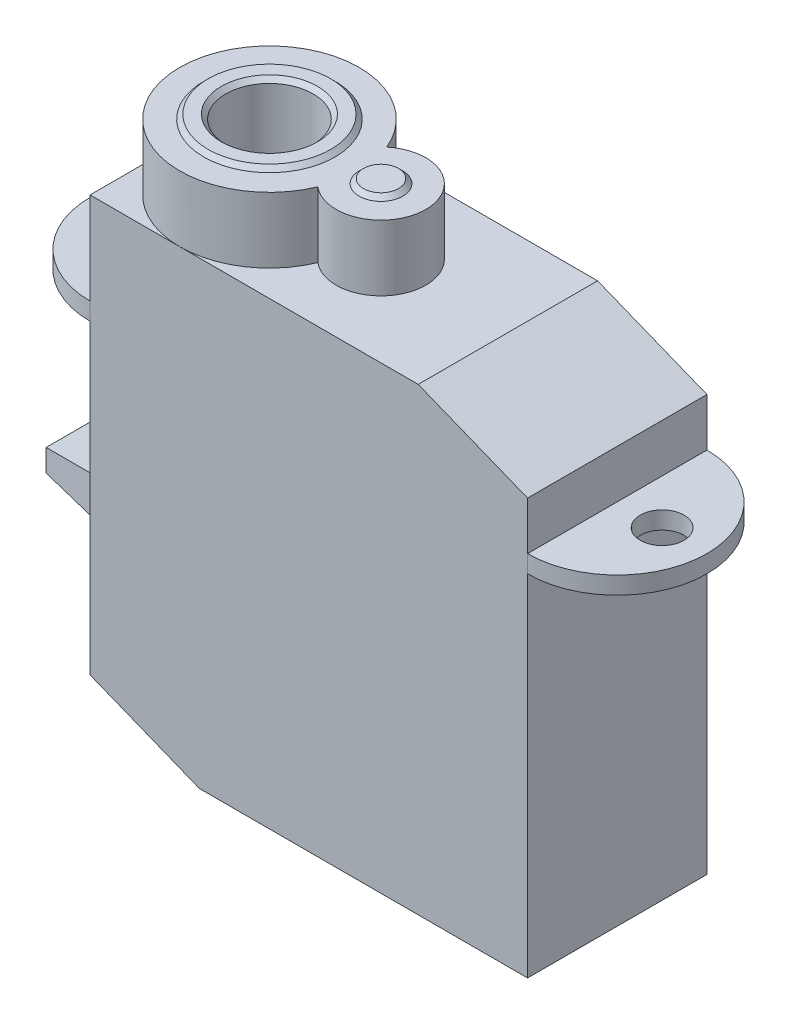
ISO-10303-21;
HEADER;
FILE_DESCRIPTION(('STEP AP214'),'2;1');
FILE_NAME('part.step','',(''),(''),'','','');
FILE_SCHEMA(('AUTOMOTIVE_DESIGN { 1 0 10303 214 1 1 1 1 }'));
ENDSEC;
DATA;
#1=APPLICATION_CONTEXT('core data for automotive mechanical design processes');
#2=APPLICATION_PROTOCOL_DEFINITION('international standard','automotive_design',2000,#1);
#3=PRODUCT_CONTEXT('',#1,'mechanical');
#4=PRODUCT('Part','Part','',(#3));
#5=PRODUCT_RELATED_PRODUCT_CATEGORY('part','',(#4));
#6=PRODUCT_DEFINITION_FORMATION('','',#4);
#7=PRODUCT_DEFINITION_CONTEXT('part definition',#1,'design');
#8=PRODUCT_DEFINITION('design','',#6,#7);
#9=PRODUCT_DEFINITION_SHAPE('','',#8);
#10=(LENGTH_UNIT() NAMED_UNIT(*) SI_UNIT(.MILLI.,.METRE.));
#11=(NAMED_UNIT(*) PLANE_ANGLE_UNIT() SI_UNIT($,.RADIAN.));
#12=(NAMED_UNIT(*) SI_UNIT($,.STERADIAN.) SOLID_ANGLE_UNIT());
#13=UNCERTAINTY_MEASURE_WITH_UNIT(LENGTH_MEASURE(1.E-05),#10,'distance_accuracy_value','');
#14=(GEOMETRIC_REPRESENTATION_CONTEXT(3) GLOBAL_UNCERTAINTY_ASSIGNED_CONTEXT((#13)) GLOBAL_UNIT_ASSIGNED_CONTEXT((#10,
#11,#12)) REPRESENTATION_CONTEXT('',''));
#15=CARTESIAN_POINT('',(0.,0.,0.));
#16=DIRECTION('',(0.,0.,1.));
#17=DIRECTION('',(1.,0.,0.));
#18=AXIS2_PLACEMENT_3D('',#15,#16,#17);
#19=CARTESIAN_POINT('',(6.65,24.,4.1));
#20=DIRECTION('',(0.,1.,0.));
#21=DIRECTION('',(0.,0.,1.));
#22=AXIS2_PLACEMENT_3D('',#19,#20,#21);
#23=PLANE('',#22);
#24=CARTESIAN_POINT('',(9.2,24.,4.1));
#25=DIRECTION('',(0.,1.,0.));
#26=DIRECTION('',(0.,0.,1.));
#27=AXIS2_PLACEMENT_3D('',#24,#25,#26);
#28=CIRCLE('',#27,1.);
#29=CARTESIAN_POINT('',(9.2,24.,5.1));
#30=VERTEX_POINT('',#29);
#31=EDGE_CURVE('E423',#30,#30,#28,.T.);
#32=ORIENTED_EDGE('',*,*,#31,.F.);
#33=EDGE_LOOP('',(#32));
#34=FACE_BOUND('',#33,.T.);
#35=CARTESIAN_POINT('',(9.2,24.,4.1));
#36=DIRECTION('',(0.,1.,0.));
#37=DIRECTION('',(0.,0.,1.));
#38=AXIS2_PLACEMENT_3D('',#35,#36,#37);
#39=CIRCLE('',#38,2.05);
#40=CARTESIAN_POINT('',(7.8860294117647,24.,5.67352511681657));
#41=VERTEX_POINT('',#40);
#42=CARTESIAN_POINT('',(7.8860294117647,24.,2.52647488318343));
#43=VERTEX_POINT('',#42);
#44=EDGE_CURVE('E223',#41,#43,#39,.T.);
#45=ORIENTED_EDGE('',*,*,#44,.T.);
#46=CARTESIAN_POINT('',(4.1,24.,4.1));
#47=DIRECTION('',(0.,1.,0.));
#48=DIRECTION('',(0.,0.,1.));
#49=AXIS2_PLACEMENT_3D('',#46,#47,#48);
#50=CIRCLE('',#49,4.1);
#51=EDGE_CURVE('E227',#43,#41,#50,.T.);
#52=ORIENTED_EDGE('',*,*,#51,.T.);
#53=EDGE_LOOP('',(#45,#52));
#54=FACE_BOUND('',#53,.T.);
#55=CARTESIAN_POINT('',(4.1,24.,4.1));
#56=DIRECTION('',(0.,1.,0.));
#57=DIRECTION('',(0.,0.,1.));
#58=AXIS2_PLACEMENT_3D('',#55,#56,#57);
#59=CIRCLE('',#58,3.);
#60=CARTESIAN_POINT('',(4.1,24.,7.1));
#61=VERTEX_POINT('',#60);
#62=EDGE_CURVE('E408',#61,#61,#59,.T.);
#63=ORIENTED_EDGE('',*,*,#62,.F.);
#64=EDGE_LOOP('',(#63));
#65=FACE_BOUND('',#64,.T.);
#66=ADVANCED_FACE('F41',(#34,#54,#65),#23,.T.);
#67=CARTESIAN_POINT('',(0.,21.,0.));
#68=DIRECTION('',(1.,0.,0.));
#69=DIRECTION('',(0.,0.,-1.));
#70=AXIS2_PLACEMENT_3D('',#67,#68,#69);
#71=PLANE('',#70);
#72=DIRECTION('',(0.,-1.,0.));
#73=VECTOR('',#72,1.);
#74=CARTESIAN_POINT('',(0.,21.,0.));
#75=LINE('',#74,#73);
#76=CARTESIAN_POINT('',(0.,16.,0.));
#77=VERTEX_POINT('',#76);
#78=CARTESIAN_POINT('',(0.,2.,0.));
#79=VERTEX_POINT('',#78);
#80=EDGE_CURVE('E332',#77,#79,#75,.T.);
#81=ORIENTED_EDGE('',*,*,#80,.T.);
#82=DIRECTION('',(0.,0.,1.));
#83=VECTOR('',#82,1.);
#84=CARTESIAN_POINT('',(0.,2.,-0.000999999999999265));
#85=LINE('',#84,#83);
#86=CARTESIAN_POINT('',(0.,2.,8.2));
#87=VERTEX_POINT('',#86);
#88=EDGE_CURVE('E213',#79,#87,#85,.T.);
#89=ORIENTED_EDGE('',*,*,#88,.T.);
#90=DIRECTION('',(0.,-1.,0.));
#91=VECTOR('',#90,1.);
#92=CARTESIAN_POINT('',(0.,21.,8.2));
#93=LINE('',#92,#91);
#94=CARTESIAN_POINT('',(0.,16.,8.2));
#95=VERTEX_POINT('',#94);
#96=EDGE_CURVE('E355',#95,#87,#93,.T.);
#97=ORIENTED_EDGE('',*,*,#96,.F.);
#98=DIRECTION('',(0.,0.,1.));
#99=VECTOR('',#98,1.);
#100=CARTESIAN_POINT('',(0.,16.,0.));
#101=LINE('',#100,#99);
#102=EDGE_CURVE('E297',#77,#95,#101,.T.);
#103=ORIENTED_EDGE('',*,*,#102,.F.);
#104=EDGE_LOOP('',(#81,#89,#97,#103));
#105=FACE_BOUND('',#104,.T.);
#106=DIRECTION('',(0.,1.,0.));
#107=VECTOR('',#106,1.);
#108=CARTESIAN_POINT('',(0.,7.,7.2));
#109=LINE('',#108,#107);
#110=CARTESIAN_POINT('',(0.,7.,7.2));
#111=VERTEX_POINT('',#110);
#112=CARTESIAN_POINT('',(0.,9.,7.2));
#113=VERTEX_POINT('',#112);
#114=EDGE_CURVE('E163',#111,#113,#109,.T.);
#115=ORIENTED_EDGE('',*,*,#114,.F.);
#116=DIRECTION('',(0.,0.,1.));
#117=VECTOR('',#116,1.);
#118=CARTESIAN_POINT('',(0.,7.,1.));
#119=LINE('',#118,#117);
#120=CARTESIAN_POINT('',(0.,7.,1.));
#121=VERTEX_POINT('',#120);
#122=EDGE_CURVE('E166',#121,#111,#119,.T.);
#123=ORIENTED_EDGE('',*,*,#122,.F.);
#124=DIRECTION('',(0.,-1.,0.));
#125=VECTOR('',#124,1.);
#126=CARTESIAN_POINT('',(0.,7.,1.));
#127=LINE('',#126,#125);
#128=CARTESIAN_POINT('',(0.,9.,1.));
#129=VERTEX_POINT('',#128);
#130=EDGE_CURVE('E65',#129,#121,#127,.T.);
#131=ORIENTED_EDGE('',*,*,#130,.F.);
#132=DIRECTION('',(0.,0.,-1.));
#133=VECTOR('',#132,1.);
#134=CARTESIAN_POINT('',(0.,9.,1.));
#135=LINE('',#134,#133);
#136=EDGE_CURVE('E60',#113,#129,#135,.T.);
#137=ORIENTED_EDGE('',*,*,#136,.F.);
#138=EDGE_LOOP('',(#115,#123,#131,#137));
#139=FACE_BOUND('',#138,.T.);
#140=ADVANCED_FACE('F165',(#105,#139),#71,.F.);
#141=CARTESIAN_POINT('',(0.,21.,0.));
#142=DIRECTION('',(0.,1.,0.));
#143=DIRECTION('',(0.,0.,1.));
#144=AXIS2_PLACEMENT_3D('',#141,#142,#143);
#145=PLANE('',#144);
#146=CARTESIAN_POINT('',(9.2,21.,4.1));
#147=DIRECTION('',(0.,1.,0.));
#148=DIRECTION('',(0.,0.,1.));
#149=AXIS2_PLACEMENT_3D('',#146,#147,#148);
#150=CIRCLE('',#149,2.05);
#151=CARTESIAN_POINT('',(7.8860294117647,21.,5.67352511681657));
#152=VERTEX_POINT('',#151);
#153=CARTESIAN_POINT('',(7.8860294117647,21.,2.52647488318343));
#154=VERTEX_POINT('',#153);
#155=EDGE_CURVE('E222',#152,#154,#150,.T.);
#156=ORIENTED_EDGE('',*,*,#155,.F.);
#157=CARTESIAN_POINT('',(4.1,21.,4.1));
#158=DIRECTION('',(0.,1.,0.));
#159=DIRECTION('',(0.,0.,1.));
#160=AXIS2_PLACEMENT_3D('',#157,#158,#159);
#161=CIRCLE('',#160,4.1);
#162=CARTESIAN_POINT('',(4.1,21.,8.2));
#163=VERTEX_POINT('',#162);
#164=EDGE_CURVE('E236',#163,#152,#161,.T.);
#165=ORIENTED_EDGE('',*,*,#164,.F.);
#166=DIRECTION('',(1.,0.,0.));
#167=VECTOR('',#166,1.);
#168=CARTESIAN_POINT('',(0.,21.,8.2));
#169=LINE('',#168,#167);
#170=CARTESIAN_POINT('',(15.,21.,8.2));
#171=VERTEX_POINT('',#170);
#172=EDGE_CURVE('E321',#163,#171,#169,.T.);
#173=ORIENTED_EDGE('',*,*,#172,.T.);
#174=DIRECTION('',(0.,0.,1.));
#175=VECTOR('',#174,1.);
#176=CARTESIAN_POINT('',(15.,21.,-0.000999999999999265));
#177=LINE('',#176,#175);
#178=CARTESIAN_POINT('',(15.,21.,0.));
#179=VERTEX_POINT('',#178);
#180=EDGE_CURVE('E292',#179,#171,#177,.T.);
#181=ORIENTED_EDGE('',*,*,#180,.F.);
#182=DIRECTION('',(-1.,0.,0.));
#183=VECTOR('',#182,1.);
#184=CARTESIAN_POINT('',(0.,21.,0.));
#185=LINE('',#184,#183);
#186=CARTESIAN_POINT('',(4.1,21.,0.));
#187=VERTEX_POINT('',#186);
#188=EDGE_CURVE('E328',#179,#187,#185,.T.);
#189=ORIENTED_EDGE('',*,*,#188,.T.);
#190=EDGE_CURVE('E53',#154,#187,#161,.T.);
#191=ORIENTED_EDGE('',*,*,#190,.F.);
#192=EDGE_LOOP('',(#156,#165,#173,#181,#189,#191));
#193=FACE_BOUND('',#192,.T.);
#194=ADVANCED_FACE('F526',(#193),#145,.T.);
#195=CARTESIAN_POINT('',(0.,21.,4.1));
#196=VERTEX_POINT('',#195);
#197=EDGE_CURVE('E11',#187,#196,#161,.T.);
#198=ORIENTED_EDGE('',*,*,#197,.F.);
#199=CARTESIAN_POINT('',(0.,21.,0.));
#200=VERTEX_POINT('',#199);
#201=EDGE_CURVE('E327',#187,#200,#185,.T.);
#202=ORIENTED_EDGE('',*,*,#201,.T.);
#203=DIRECTION('',(0.,0.,1.));
#204=VECTOR('',#203,1.);
#205=CARTESIAN_POINT('',(0.,21.,0.));
#206=LINE('',#205,#204);
#207=EDGE_CURVE('E317',#200,#196,#206,.T.);
#208=ORIENTED_EDGE('',*,*,#207,.T.);
#209=EDGE_LOOP('',(#198,#202,#208));
#210=FACE_BOUND('',#209,.T.);
#211=ADVANCED_FACE('F527',(#210),#145,.T.);
#212=CARTESIAN_POINT('',(0.,21.,8.2));
#213=DIRECTION('',(0.,0.,-1.));
#214=DIRECTION('',(-1.,0.,0.));
#215=AXIS2_PLACEMENT_3D('',#212,#213,#214);
#216=PLANE('',#215);
#217=ORIENTED_EDGE('',*,*,#96,.T.);
#218=DIRECTION('',(-0.928476690885259,0.371390676354104,0.));
#219=VECTOR('',#218,1.);
#220=CARTESIAN_POINT('',(0.,2.,8.2));
#221=LINE('',#220,#219);
#222=CARTESIAN_POINT('',(5.,0.,8.2));
#223=VERTEX_POINT('',#222);
#224=EDGE_CURVE('E209',#223,#87,#221,.T.);
#225=ORIENTED_EDGE('',*,*,#224,.F.);
#226=DIRECTION('',(1.,0.,0.));
#227=VECTOR('',#226,1.);
#228=CARTESIAN_POINT('',(0.,0.,8.2));
#229=LINE('',#228,#227);
#230=CARTESIAN_POINT('',(20.,0.,8.2));
#231=VERTEX_POINT('',#230);
#232=EDGE_CURVE('E316',#223,#231,#229,.T.);
#233=ORIENTED_EDGE('',*,*,#232,.T.);
#234=DIRECTION('',(0.,-1.,0.));
#235=VECTOR('',#234,1.);
#236=CARTESIAN_POINT('',(20.,21.,8.2));
#237=LINE('',#236,#235);
#238=CARTESIAN_POINT('',(20.,16.,8.2));
#239=VERTEX_POINT('',#238);
#240=EDGE_CURVE('E351',#239,#231,#237,.T.);
#241=ORIENTED_EDGE('',*,*,#240,.F.);
#242=DIRECTION('',(0.,1.,0.));
#243=VECTOR('',#242,1.);
#244=CARTESIAN_POINT('',(20.,-0.001000000000001,8.2));
#245=LINE('',#244,#243);
#246=CARTESIAN_POINT('',(20.,16.8,8.2));
#247=VERTEX_POINT('',#246);
#248=EDGE_CURVE('E281',#239,#247,#245,.T.);
#249=ORIENTED_EDGE('',*,*,#248,.T.);
#250=CARTESIAN_POINT('',(20.,19.,8.2));
#251=VERTEX_POINT('',#250);
#252=EDGE_CURVE('E352',#251,#247,#237,.T.);
#253=ORIENTED_EDGE('',*,*,#252,.F.);
#254=DIRECTION('',(0.92847669088526,-0.371390676354103,0.));
#255=VECTOR('',#254,1.);
#256=CARTESIAN_POINT('',(20.,19.,8.2));
#257=LINE('',#256,#255);
#258=EDGE_CURVE('E289',#171,#251,#257,.T.);
#259=ORIENTED_EDGE('',*,*,#258,.F.);
#260=ORIENTED_EDGE('',*,*,#172,.F.);
#261=CARTESIAN_POINT('',(0.,21.,8.2));
#262=VERTEX_POINT('',#261);
#263=EDGE_CURVE('E323',#262,#163,#169,.T.);
#264=ORIENTED_EDGE('',*,*,#263,.F.);
#265=CARTESIAN_POINT('',(0.,16.8,8.2));
#266=VERTEX_POINT('',#265);
#267=EDGE_CURVE('E45',#262,#266,#93,.T.);
#268=ORIENTED_EDGE('',*,*,#267,.T.);
#269=DIRECTION('',(0.,1.,0.));
#270=VECTOR('',#269,1.);
#271=CARTESIAN_POINT('',(0.,-0.001000000000001,8.2));
#272=LINE('',#271,#270);
#273=EDGE_CURVE('E269',#95,#266,#272,.T.);
#274=ORIENTED_EDGE('',*,*,#273,.F.);
#275=EDGE_LOOP('',(#217,#225,#233,#241,#249,#253,#259,#260,#264,#268,#274));
#276=FACE_BOUND('',#275,.T.);
#277=ADVANCED_FACE('F532',(#276),#216,.F.);
#278=CARTESIAN_POINT('',(0.,21.,0.));
#279=DIRECTION('',(0.,0.,1.));
#280=DIRECTION('',(1.,0.,0.));
#281=AXIS2_PLACEMENT_3D('',#278,#279,#280);
#282=PLANE('',#281);
#283=DIRECTION('',(-1.,0.,0.));
#284=VECTOR('',#283,1.);
#285=CARTESIAN_POINT('',(0.,0.,0.));
#286=LINE('',#285,#284);
#287=CARTESIAN_POINT('',(20.,0.,0.));
#288=VERTEX_POINT('',#287);
#289=CARTESIAN_POINT('',(5.,0.,0.));
#290=VERTEX_POINT('',#289);
#291=EDGE_CURVE('E339',#288,#290,#286,.T.);
#292=ORIENTED_EDGE('',*,*,#291,.T.);
#293=DIRECTION('',(0.92847669088526,-0.371390676354104,0.));
#294=VECTOR('',#293,1.);
#295=CARTESIAN_POINT('',(0.,2.,0.));
#296=LINE('',#295,#294);
#297=EDGE_CURVE('E217',#79,#290,#296,.T.);
#298=ORIENTED_EDGE('',*,*,#297,.F.);
#299=ORIENTED_EDGE('',*,*,#80,.F.);
#300=DIRECTION('',(0.,1.,0.));
#301=VECTOR('',#300,1.);
#302=CARTESIAN_POINT('',(0.,-0.001000000000001,0.));
#303=LINE('',#302,#301);
#304=CARTESIAN_POINT('',(0.,16.8,0.));
#305=VERTEX_POINT('',#304);
#306=EDGE_CURVE('E268',#77,#305,#303,.T.);
#307=ORIENTED_EDGE('',*,*,#306,.T.);
#308=EDGE_CURVE('E343',#200,#305,#75,.T.);
#309=ORIENTED_EDGE('',*,*,#308,.F.);
#310=ORIENTED_EDGE('',*,*,#201,.F.);
#311=ORIENTED_EDGE('',*,*,#188,.F.);
#312=DIRECTION('',(-0.92847669088526,0.371390676354103,0.));
#313=VECTOR('',#312,1.);
#314=CARTESIAN_POINT('',(20.,19.,0.));
#315=LINE('',#314,#313);
#316=CARTESIAN_POINT('',(20.,19.,0.));
#317=VERTEX_POINT('',#316);
#318=EDGE_CURVE('E272',#317,#179,#315,.T.);
#319=ORIENTED_EDGE('',*,*,#318,.F.);
#320=DIRECTION('',(0.,-1.,0.));
#321=VECTOR('',#320,1.);
#322=CARTESIAN_POINT('',(20.,21.,0.));
#323=LINE('',#322,#321);
#324=CARTESIAN_POINT('',(20.,16.8,0.));
#325=VERTEX_POINT('',#324);
#326=EDGE_CURVE('E348',#317,#325,#323,.T.);
#327=ORIENTED_EDGE('',*,*,#326,.T.);
#328=DIRECTION('',(0.,1.,0.));
#329=VECTOR('',#328,1.);
#330=CARTESIAN_POINT('',(20.,-0.001000000000001,0.));
#331=LINE('',#330,#329);
#332=CARTESIAN_POINT('',(20.,16.,0.));
#333=VERTEX_POINT('',#332);
#334=EDGE_CURVE('E265',#333,#325,#331,.T.);
#335=ORIENTED_EDGE('',*,*,#334,.F.);
#336=EDGE_CURVE('E347',#333,#288,#323,.T.);
#337=ORIENTED_EDGE('',*,*,#336,.T.);
#338=EDGE_LOOP('',(#292,#298,#299,#307,#309,#310,#311,#319,#327,#335,#337));
#339=FACE_BOUND('',#338,.T.);
#340=ADVANCED_FACE('F377',(#339),#282,.F.);
#341=DIRECTION('',(0.,0.,-1.));
#342=VECTOR('',#341,1.);
#343=CARTESIAN_POINT('',(0.,16.8,0.));
#344=LINE('',#343,#342);
#345=EDGE_CURVE('E304',#266,#305,#344,.T.);
#346=ORIENTED_EDGE('',*,*,#345,.F.);
#347=ORIENTED_EDGE('',*,*,#267,.F.);
#348=EDGE_CURVE('E322',#196,#262,#206,.T.);
#349=ORIENTED_EDGE('',*,*,#348,.F.);
#350=ORIENTED_EDGE('',*,*,#207,.F.);
#351=ORIENTED_EDGE('',*,*,#308,.T.);
#352=EDGE_LOOP('',(#346,#347,#349,#350,#351));
#353=FACE_BOUND('',#352,.T.);
#354=ADVANCED_FACE('F43',(#353),#71,.F.);
#355=CARTESIAN_POINT('',(20.,21.,0.));
#356=DIRECTION('',(-1.,0.,0.));
#357=DIRECTION('',(0.,0.,1.));
#358=AXIS2_PLACEMENT_3D('',#355,#356,#357);
#359=PLANE('',#358);
#360=DIRECTION('',(0.,0.,-1.));
#361=VECTOR('',#360,1.);
#362=CARTESIAN_POINT('',(20.,16.,8.2));
#363=LINE('',#362,#361);
#364=EDGE_CURVE('E308',#239,#333,#363,.T.);
#365=ORIENTED_EDGE('',*,*,#364,.F.);
#366=ORIENTED_EDGE('',*,*,#240,.T.);
#367=DIRECTION('',(0.,0.,-1.));
#368=VECTOR('',#367,1.);
#369=CARTESIAN_POINT('',(20.,0.,0.));
#370=LINE('',#369,#368);
#371=EDGE_CURVE('E335',#231,#288,#370,.T.);
#372=ORIENTED_EDGE('',*,*,#371,.T.);
#373=ORIENTED_EDGE('',*,*,#336,.F.);
#374=EDGE_LOOP('',(#365,#366,#372,#373));
#375=FACE_BOUND('',#374,.T.);
#376=ADVANCED_FACE('F367',(#375),#359,.F.);
#377=ORIENTED_EDGE('',*,*,#326,.F.);
#378=DIRECTION('',(0.,0.,1.));
#379=VECTOR('',#378,1.);
#380=CARTESIAN_POINT('',(20.,19.,-0.000999999999999265));
#381=LINE('',#380,#379);
#382=EDGE_CURVE('E293',#317,#251,#381,.T.);
#383=ORIENTED_EDGE('',*,*,#382,.T.);
#384=ORIENTED_EDGE('',*,*,#252,.T.);
#385=DIRECTION('',(0.,0.,-1.));
#386=VECTOR('',#385,1.);
#387=CARTESIAN_POINT('',(20.,16.8,8.2));
#388=LINE('',#387,#386);
#389=EDGE_CURVE('E312',#247,#325,#388,.T.);
#390=ORIENTED_EDGE('',*,*,#389,.T.);
#391=EDGE_LOOP('',(#377,#383,#384,#390));
#392=FACE_BOUND('',#391,.T.);
#393=ADVANCED_FACE('F524',(#392),#359,.F.);
#394=EDGE_CURVE('E51',#196,#163,#161,.T.);
#395=ORIENTED_EDGE('',*,*,#394,.F.);
#396=ORIENTED_EDGE('',*,*,#348,.T.);
#397=ORIENTED_EDGE('',*,*,#263,.T.);
#398=EDGE_LOOP('',(#395,#396,#397));
#399=FACE_BOUND('',#398,.T.);
#400=ADVANCED_FACE('F521',(#399),#145,.T.);
#401=CARTESIAN_POINT('',(0.,0.,0.));
#402=DIRECTION('',(0.,1.,0.));
#403=DIRECTION('',(0.,0.,1.));
#404=AXIS2_PLACEMENT_3D('',#401,#402,#403);
#405=PLANE('',#404);
#406=ORIENTED_EDGE('',*,*,#232,.F.);
#407=DIRECTION('',(0.,0.,1.));
#408=VECTOR('',#407,1.);
#409=CARTESIAN_POINT('',(5.,0.,-0.000999999999999265));
#410=LINE('',#409,#408);
#411=EDGE_CURVE('E212',#290,#223,#410,.T.);
#412=ORIENTED_EDGE('',*,*,#411,.F.);
#413=ORIENTED_EDGE('',*,*,#291,.F.);
#414=ORIENTED_EDGE('',*,*,#371,.F.);
#415=EDGE_LOOP('',(#406,#412,#413,#414));
#416=FACE_BOUND('',#415,.T.);
#417=ADVANCED_FACE('F373',(#416),#405,.F.);
#418=CARTESIAN_POINT('',(25.,16.,8.2));
#419=DIRECTION('',(0.,1.,0.));
#420=DIRECTION('',(0.,0.,1.));
#421=AXIS2_PLACEMENT_3D('',#418,#419,#420);
#422=PLANE('',#421);
#423=CARTESIAN_POINT('',(22.05,16.,4.1));
#424=DIRECTION('',(0.,1.,0.));
#425=DIRECTION('',(0.,0.,1.));
#426=AXIS2_PLACEMENT_3D('',#423,#424,#425);
#427=CIRCLE('',#426,1.);
#428=CARTESIAN_POINT('',(22.05,16.,5.1));
#429=VERTEX_POINT('',#428);
#430=EDGE_CURVE('E256',#429,#429,#427,.T.);
#431=ORIENTED_EDGE('',*,*,#430,.T.);
#432=EDGE_LOOP('',(#431));
#433=FACE_BOUND('',#432,.T.);
#434=ORIENTED_EDGE('',*,*,#364,.T.);
#435=CARTESIAN_POINT('',(20.,16.,4.1));
#436=DIRECTION('',(0.,1.,0.));
#437=DIRECTION('',(0.,0.,1.));
#438=AXIS2_PLACEMENT_3D('',#435,#436,#437);
#439=CIRCLE('',#438,4.1);
#440=EDGE_CURVE('E260',#239,#333,#439,.T.);
#441=ORIENTED_EDGE('',*,*,#440,.F.);
#442=EDGE_LOOP('',(#434,#441));
#443=FACE_BOUND('',#442,.T.);
#444=ADVANCED_FACE('F516',(#433,#443),#422,.F.);
#445=CARTESIAN_POINT('',(25.,16.8,8.2));
#446=DIRECTION('',(0.,1.,0.));
#447=DIRECTION('',(0.,0.,1.));
#448=AXIS2_PLACEMENT_3D('',#445,#446,#447);
#449=PLANE('',#448);
#450=CARTESIAN_POINT('',(22.05,16.8,4.1));
#451=DIRECTION('',(0.,1.,0.));
#452=DIRECTION('',(0.,0.,1.));
#453=AXIS2_PLACEMENT_3D('',#450,#451,#452);
#454=CIRCLE('',#453,1.);
#455=CARTESIAN_POINT('',(22.05,16.8,5.1));
#456=VERTEX_POINT('',#455);
#457=EDGE_CURVE('E252',#456,#456,#454,.T.);
#458=ORIENTED_EDGE('',*,*,#457,.F.);
#459=EDGE_LOOP('',(#458));
#460=FACE_BOUND('',#459,.T.);
#461=CARTESIAN_POINT('',(20.,16.8,4.1));
#462=DIRECTION('',(0.,-1.,0.));
#463=DIRECTION('',(0.,0.,1.));
#464=AXIS2_PLACEMENT_3D('',#461,#462,#463);
#465=CIRCLE('',#464,4.1);
#466=EDGE_CURVE('E278',#325,#247,#465,.T.);
#467=ORIENTED_EDGE('',*,*,#466,.F.);
#468=ORIENTED_EDGE('',*,*,#389,.F.);
#469=EDGE_LOOP('',(#467,#468));
#470=FACE_BOUND('',#469,.T.);
#471=ADVANCED_FACE('F512',(#460,#470),#449,.T.);
#472=CARTESIAN_POINT('',(-5.,16.,0.));
#473=DIRECTION('',(0.,1.,0.));
#474=DIRECTION('',(0.,0.,1.));
#475=AXIS2_PLACEMENT_3D('',#472,#473,#474);
#476=PLANE('',#475);
#477=CARTESIAN_POINT('',(-2.05,16.,4.1));
#478=DIRECTION('',(0.,1.,0.));
#479=DIRECTION('',(0.,0.,1.));
#480=AXIS2_PLACEMENT_3D('',#477,#478,#479);
#481=CIRCLE('',#480,1.);
#482=CARTESIAN_POINT('',(-2.05,16.,5.1));
#483=VERTEX_POINT('',#482);
#484=EDGE_CURVE('E248',#483,#483,#481,.T.);
#485=ORIENTED_EDGE('',*,*,#484,.T.);
#486=EDGE_LOOP('',(#485));
#487=FACE_BOUND('',#486,.T.);
#488=ORIENTED_EDGE('',*,*,#102,.T.);
#489=CARTESIAN_POINT('',(0.,16.,4.1));
#490=DIRECTION('',(0.,1.,0.));
#491=DIRECTION('',(0.,0.,1.));
#492=AXIS2_PLACEMENT_3D('',#489,#490,#491);
#493=CIRCLE('',#492,4.1);
#494=EDGE_CURVE('E261',#77,#95,#493,.T.);
#495=ORIENTED_EDGE('',*,*,#494,.F.);
#496=EDGE_LOOP('',(#488,#495));
#497=FACE_BOUND('',#496,.T.);
#498=ADVANCED_FACE('F508',(#487,#497),#476,.F.);
#499=CARTESIAN_POINT('',(-5.,16.8,0.));
#500=DIRECTION('',(0.,-1.,0.));
#501=DIRECTION('',(0.,0.,-1.));
#502=AXIS2_PLACEMENT_3D('',#499,#500,#501);
#503=PLANE('',#502);
#504=CARTESIAN_POINT('',(-2.05,16.8,4.1));
#505=DIRECTION('',(0.,1.,0.));
#506=DIRECTION('',(0.,0.,1.));
#507=AXIS2_PLACEMENT_3D('',#504,#505,#506);
#508=CIRCLE('',#507,1.);
#509=CARTESIAN_POINT('',(-2.05,16.8,5.1));
#510=VERTEX_POINT('',#509);
#511=EDGE_CURVE('E244',#510,#510,#508,.T.);
#512=ORIENTED_EDGE('',*,*,#511,.F.);
#513=EDGE_LOOP('',(#512));
#514=FACE_BOUND('',#513,.T.);
#515=ORIENTED_EDGE('',*,*,#345,.T.);
#516=CARTESIAN_POINT('',(0.,16.8,4.1));
#517=DIRECTION('',(0.,-1.,0.));
#518=DIRECTION('',(0.,0.,1.));
#519=AXIS2_PLACEMENT_3D('',#516,#517,#518);
#520=CIRCLE('',#519,4.1);
#521=EDGE_CURVE('E264',#266,#305,#520,.T.);
#522=ORIENTED_EDGE('',*,*,#521,.F.);
#523=EDGE_LOOP('',(#515,#522));
#524=FACE_BOUND('',#523,.T.);
#525=ADVANCED_FACE('F504',(#514,#524),#503,.F.);
#526=CARTESIAN_POINT('',(20.,19.,-0.000999999999999265));
#527=DIRECTION('',(-0.371390676354103,-0.928476690885259,0.));
#528=DIRECTION('',(0.92847669088526,-0.371390676354103,0.));
#529=AXIS2_PLACEMENT_3D('',#526,#527,#528);
#530=PLANE('',#529);
#531=ORIENTED_EDGE('',*,*,#318,.T.);
#532=ORIENTED_EDGE('',*,*,#180,.T.);
#533=ORIENTED_EDGE('',*,*,#258,.T.);
#534=ORIENTED_EDGE('',*,*,#382,.F.);
#535=EDGE_LOOP('',(#531,#532,#533,#534));
#536=FACE_BOUND('',#535,.T.);
#537=ADVANCED_FACE('F497',(#536),#530,.F.);
#538=CARTESIAN_POINT('',(0.,-0.001000000000001,4.1));
#539=DIRECTION('',(0.,1.,0.));
#540=DIRECTION('',(0.,0.,1.));
#541=AXIS2_PLACEMENT_3D('',#538,#539,#540);
#542=CYLINDRICAL_SURFACE('',#541,4.1);
#543=ORIENTED_EDGE('',*,*,#494,.T.);
#544=ORIENTED_EDGE('',*,*,#273,.T.);
#545=ORIENTED_EDGE('',*,*,#521,.T.);
#546=ORIENTED_EDGE('',*,*,#306,.F.);
#547=EDGE_LOOP('',(#543,#544,#545,#546));
#548=FACE_BOUND('',#547,.T.);
#549=ADVANCED_FACE('F494',(#548),#542,.T.);
#550=CARTESIAN_POINT('',(20.,-0.001000000000001,4.1));
#551=DIRECTION('',(0.,1.,0.));
#552=DIRECTION('',(0.,0.,1.));
#553=AXIS2_PLACEMENT_3D('',#550,#551,#552);
#554=CYLINDRICAL_SURFACE('',#553,4.1);
#555=ORIENTED_EDGE('',*,*,#440,.T.);
#556=ORIENTED_EDGE('',*,*,#334,.T.);
#557=ORIENTED_EDGE('',*,*,#466,.T.);
#558=ORIENTED_EDGE('',*,*,#248,.F.);
#559=EDGE_LOOP('',(#555,#556,#557,#558));
#560=FACE_BOUND('',#559,.T.);
#561=ADVANCED_FACE('F492',(#560),#554,.T.);
#562=CARTESIAN_POINT('',(22.05,16.8,4.1));
#563=DIRECTION('',(0.,1.,0.));
#564=DIRECTION('',(0.,0.,1.));
#565=AXIS2_PLACEMENT_3D('',#562,#563,#564);
#566=CYLINDRICAL_SURFACE('',#565,1.);
#567=ORIENTED_EDGE('',*,*,#430,.F.);
#568=EDGE_LOOP('',(#567));
#569=FACE_BOUND('',#568,.T.);
#570=ORIENTED_EDGE('',*,*,#457,.T.);
#571=EDGE_LOOP('',(#570));
#572=FACE_BOUND('',#571,.T.);
#573=ADVANCED_FACE('F488',(#569,#572),#566,.F.);
#574=CARTESIAN_POINT('',(-2.05,16.8,4.1));
#575=DIRECTION('',(0.,1.,0.));
#576=DIRECTION('',(0.,0.,1.));
#577=AXIS2_PLACEMENT_3D('',#574,#575,#576);
#578=CYLINDRICAL_SURFACE('',#577,1.);
#579=ORIENTED_EDGE('',*,*,#484,.F.);
#580=EDGE_LOOP('',(#579));
#581=FACE_BOUND('',#580,.T.);
#582=ORIENTED_EDGE('',*,*,#511,.T.);
#583=EDGE_LOOP('',(#582));
#584=FACE_BOUND('',#583,.T.);
#585=ADVANCED_FACE('F484',(#581,#584),#578,.F.);
#586=CARTESIAN_POINT('',(9.2,24.,4.1));
#587=DIRECTION('',(0.,-1.,0.));
#588=DIRECTION('',(0.,0.,-1.));
#589=AXIS2_PLACEMENT_3D('',#586,#587,#588);
#590=CYLINDRICAL_SURFACE('',#589,2.05);
#591=ORIENTED_EDGE('',*,*,#155,.T.);
#592=DIRECTION('',(0.,-1.,0.));
#593=VECTOR('',#592,1.);
#594=CARTESIAN_POINT('',(7.8860294117647,24.,2.52647488318343));
#595=LINE('',#594,#593);
#596=EDGE_CURVE('E240',#43,#154,#595,.T.);
#597=ORIENTED_EDGE('',*,*,#596,.F.);
#598=ORIENTED_EDGE('',*,*,#44,.F.);
#599=DIRECTION('',(0.,-1.,0.));
#600=VECTOR('',#599,1.);
#601=CARTESIAN_POINT('',(7.8860294117647,24.,5.67352511681657));
#602=LINE('',#601,#600);
#603=EDGE_CURVE('E230',#41,#152,#602,.T.);
#604=ORIENTED_EDGE('',*,*,#603,.T.);
#605=EDGE_LOOP('',(#591,#597,#598,#604));
#606=FACE_BOUND('',#605,.T.);
#607=ADVANCED_FACE('F480',(#606),#590,.T.);
#608=CARTESIAN_POINT('',(4.1,24.,4.1));
#609=DIRECTION('',(0.,-1.,0.));
#610=DIRECTION('',(0.,0.,-1.));
#611=AXIS2_PLACEMENT_3D('',#608,#609,#610);
#612=CYLINDRICAL_SURFACE('',#611,4.1);
#613=ORIENTED_EDGE('',*,*,#190,.T.);
#614=ORIENTED_EDGE('',*,*,#197,.T.);
#615=ORIENTED_EDGE('',*,*,#394,.T.);
#616=ORIENTED_EDGE('',*,*,#164,.T.);
#617=ORIENTED_EDGE('',*,*,#603,.F.);
#618=ORIENTED_EDGE('',*,*,#51,.F.);
#619=ORIENTED_EDGE('',*,*,#596,.T.);
#620=EDGE_LOOP('',(#613,#614,#615,#616,#617,#618,#619));
#621=FACE_BOUND('',#620,.T.);
#622=ADVANCED_FACE('F475',(#621),#612,.T.);
#623=CARTESIAN_POINT('',(0.,2.,-0.000999999999999265));
#624=DIRECTION('',(0.371390676354104,0.928476690885259,0.));
#625=DIRECTION('',(-0.928476690885259,0.371390676354104,0.));
#626=AXIS2_PLACEMENT_3D('',#623,#624,#625);
#627=PLANE('',#626);
#628=ORIENTED_EDGE('',*,*,#297,.T.);
#629=ORIENTED_EDGE('',*,*,#411,.T.);
#630=ORIENTED_EDGE('',*,*,#224,.T.);
#631=ORIENTED_EDGE('',*,*,#88,.F.);
#632=EDGE_LOOP('',(#628,#629,#630,#631));
#633=FACE_BOUND('',#632,.T.);
#634=ADVANCED_FACE('F467',(#633),#627,.F.);
#635=CARTESIAN_POINT('',(0.,7.,7.2));
#636=DIRECTION('',(-0.139173100960066,0.,0.99026806874157));
#637=DIRECTION('',(0.99026806874157,0.,0.139173100960066));
#638=AXIS2_PLACEMENT_3D('',#635,#636,#637);
#639=PLANE('',#638);
#640=ORIENTED_EDGE('',*,*,#114,.T.);
#641=DIRECTION('',(0.980814848463989,0.137844537491629,0.137844537491629));
#642=VECTOR('',#641,1.);
#643=CARTESIAN_POINT('',(-0.838239808738931,8.88219307759906,7.08219307759906));
#644=LINE('',#643,#642);
#645=CARTESIAN_POINT('',(-3.5,8.50810707854163,6.70810707854163));
#646=VERTEX_POINT('',#645);
#647=EDGE_CURVE('E197',#646,#113,#644,.T.);
#648=ORIENTED_EDGE('',*,*,#647,.F.);
#649=DIRECTION('',(0.,-1.,0.));
#650=VECTOR('',#649,1.);
#651=CARTESIAN_POINT('',(-3.5,0.,6.70810707854163));
#652=LINE('',#651,#650);
#653=CARTESIAN_POINT('',(-3.5,7.49189292145837,6.70810707854163));
#654=VERTEX_POINT('',#653);
#655=EDGE_CURVE('E183',#654,#646,#652,.F.);
#656=ORIENTED_EDGE('',*,*,#655,.F.);
#657=DIRECTION('',(0.980814848463989,-0.137844537491629,0.137844537491629));
#658=VECTOR('',#657,1.);
#659=CARTESIAN_POINT('',(0.,7.,7.2));
#660=LINE('',#659,#658);
#661=EDGE_CURVE('E178',#654,#111,#660,.T.);
#662=ORIENTED_EDGE('',*,*,#661,.T.);
#663=EDGE_LOOP('',(#640,#648,#656,#662));
#664=FACE_BOUND('',#663,.T.);
#665=ADVANCED_FACE('F185',(#664),#639,.T.);
#666=CARTESIAN_POINT('',(0.,9.,1.));
#667=DIRECTION('',(-0.139173100960066,0.99026806874157,0.));
#668=DIRECTION('',(-0.99026806874157,-0.139173100960066,0.));
#669=AXIS2_PLACEMENT_3D('',#666,#667,#668);
#670=PLANE('',#669);
#671=ORIENTED_EDGE('',*,*,#136,.T.);
#672=DIRECTION('',(0.980814848463989,0.137844537491629,-0.137844537491629));
#673=VECTOR('',#672,1.);
#674=CARTESIAN_POINT('',(-0.270399938302881,8.96199776696744,1.03800223303256));
#675=LINE('',#674,#673);
#676=CARTESIAN_POINT('',(-3.5,8.50810707854163,1.49189292145837));
#677=VERTEX_POINT('',#676);
#678=EDGE_CURVE('E192',#677,#129,#675,.T.);
#679=ORIENTED_EDGE('',*,*,#678,.F.);
#680=DIRECTION('',(0.,0.,1.));
#681=VECTOR('',#680,1.);
#682=CARTESIAN_POINT('',(-3.5,8.50810707854163,0.));
#683=LINE('',#682,#681);
#684=EDGE_CURVE('E204',#646,#677,#683,.F.);
#685=ORIENTED_EDGE('',*,*,#684,.F.);
#686=ORIENTED_EDGE('',*,*,#647,.T.);
#687=EDGE_LOOP('',(#671,#679,#685,#686));
#688=FACE_BOUND('',#687,.T.);
#689=ADVANCED_FACE('F388',(#688),#670,.T.);
#690=CARTESIAN_POINT('',(0.,7.,1.));
#691=DIRECTION('',(-0.139173100960066,0.,-0.99026806874157));
#692=DIRECTION('',(-0.99026806874157,0.,0.139173100960066));
#693=AXIS2_PLACEMENT_3D('',#690,#691,#692);
#694=PLANE('',#693);
#695=ORIENTED_EDGE('',*,*,#130,.T.);
#696=DIRECTION('',(0.980814848463989,-0.137844537491629,-0.137844537491629));
#697=VECTOR('',#696,1.);
#698=CARTESIAN_POINT('',(0.,7.,1.));
#699=LINE('',#698,#697);
#700=CARTESIAN_POINT('',(-3.5,7.49189292145837,1.49189292145837));
#701=VERTEX_POINT('',#700);
#702=EDGE_CURVE('E181',#701,#121,#699,.T.);
#703=ORIENTED_EDGE('',*,*,#702,.F.);
#704=DIRECTION('',(0.,1.,0.));
#705=VECTOR('',#704,1.);
#706=CARTESIAN_POINT('',(-3.5,0.,1.49189292145837));
#707=LINE('',#706,#705);
#708=EDGE_CURVE('E194',#677,#701,#707,.F.);
#709=ORIENTED_EDGE('',*,*,#708,.F.);
#710=ORIENTED_EDGE('',*,*,#678,.T.);
#711=EDGE_LOOP('',(#695,#703,#709,#710));
#712=FACE_BOUND('',#711,.T.);
#713=ADVANCED_FACE('F394',(#712),#694,.T.);
#714=CARTESIAN_POINT('',(0.,7.,1.));
#715=DIRECTION('',(-0.139173100960066,-0.99026806874157,0.));
#716=DIRECTION('',(0.99026806874157,-0.139173100960066,0.));
#717=AXIS2_PLACEMENT_3D('',#714,#715,#716);
#718=PLANE('',#717);
#719=ORIENTED_EDGE('',*,*,#122,.T.);
#720=ORIENTED_EDGE('',*,*,#661,.F.);
#721=DIRECTION('',(0.,0.,-1.));
#722=VECTOR('',#721,1.);
#723=CARTESIAN_POINT('',(-3.5,7.49189292145837,0.));
#724=LINE('',#723,#722);
#725=EDGE_CURVE('E188',#701,#654,#724,.F.);
#726=ORIENTED_EDGE('',*,*,#725,.F.);
#727=ORIENTED_EDGE('',*,*,#702,.T.);
#728=EDGE_LOOP('',(#719,#720,#726,#727));
#729=FACE_BOUND('',#728,.T.);
#730=ADVANCED_FACE('F176',(#729),#718,.T.);
#731=CARTESIAN_POINT('',(-3.5,0.,0.));
#732=DIRECTION('',(1.,0.,0.));
#733=DIRECTION('',(0.,0.,-1.));
#734=AXIS2_PLACEMENT_3D('',#731,#732,#733);
#735=PLANE('',#734);
#736=ORIENTED_EDGE('',*,*,#655,.T.);
#737=ORIENTED_EDGE('',*,*,#684,.T.);
#738=ORIENTED_EDGE('',*,*,#708,.T.);
#739=ORIENTED_EDGE('',*,*,#725,.T.);
#740=EDGE_LOOP('',(#736,#737,#738,#739));
#741=FACE_BOUND('',#740,.T.);
#742=ADVANCED_FACE('F392',(#741),#735,.F.);
#743=CARTESIAN_POINT('',(4.1,24.2,4.1));
#744=DIRECTION('',(0.,1.,0.));
#745=DIRECTION('',(0.,0.,1.));
#746=AXIS2_PLACEMENT_3D('',#743,#744,#745);
#747=PLANE('',#746);
#748=CARTESIAN_POINT('',(4.1,24.2,4.1));
#749=DIRECTION('',(0.,1.,0.));
#750=DIRECTION('',(0.,0.,1.));
#751=AXIS2_PLACEMENT_3D('',#748,#749,#750);
#752=CIRCLE('',#751,2.8);
#753=CARTESIAN_POINT('',(4.1,24.2,6.9));
#754=VERTEX_POINT('',#753);
#755=EDGE_CURVE('E403',#754,#754,#752,.T.);
#756=ORIENTED_EDGE('',*,*,#755,.T.);
#757=EDGE_LOOP('',(#756));
#758=FACE_BOUND('',#757,.T.);
#759=CARTESIAN_POINT('',(4.1,24.2,4.1));
#760=DIRECTION('',(0.,1.,0.));
#761=DIRECTION('',(0.,0.,1.));
#762=AXIS2_PLACEMENT_3D('',#759,#760,#761);
#763=CIRCLE('',#762,2.2);
#764=CARTESIAN_POINT('',(4.1,24.2,6.3));
#765=VERTEX_POINT('',#764);
#766=EDGE_CURVE('E404',#765,#765,#763,.T.);
#767=ORIENTED_EDGE('',*,*,#766,.F.);
#768=EDGE_LOOP('',(#767));
#769=FACE_BOUND('',#768,.T.);
#770=ADVANCED_FACE('F441',(#758,#769),#747,.T.);
#771=CARTESIAN_POINT('',(4.1,24.,4.1));
#772=DIRECTION('',(0.,-1.,0.));
#773=DIRECTION('',(0.,0.,1.));
#774=AXIS2_PLACEMENT_3D('',#771,#772,#773);
#775=CONICAL_SURFACE('',#774,3.,0.78539816339745);
#776=ORIENTED_EDGE('',*,*,#755,.F.);
#777=EDGE_LOOP('',(#776));
#778=FACE_BOUND('',#777,.T.);
#779=ORIENTED_EDGE('',*,*,#62,.T.);
#780=EDGE_LOOP('',(#779));
#781=FACE_BOUND('',#780,.T.);
#782=ADVANCED_FACE('F438',(#778,#781),#775,.T.);
#783=CARTESIAN_POINT('',(4.1,24.,4.1));
#784=DIRECTION('',(0.,1.,0.));
#785=DIRECTION('',(0.,0.,1.));
#786=AXIS2_PLACEMENT_3D('',#783,#784,#785);
#787=CONICAL_SURFACE('',#786,2.,0.78539816339745);
#788=ORIENTED_EDGE('',*,*,#766,.T.);
#789=EDGE_LOOP('',(#788));
#790=FACE_BOUND('',#789,.T.);
#791=CARTESIAN_POINT('',(4.1,24.,4.1));
#792=DIRECTION('',(0.,1.,0.));
#793=DIRECTION('',(0.,0.,1.));
#794=AXIS2_PLACEMENT_3D('',#791,#792,#793);
#795=CIRCLE('',#794,2.);
#796=CARTESIAN_POINT('',(4.1,24.,6.1));
#797=VERTEX_POINT('',#796);
#798=EDGE_CURVE('E409',#797,#797,#795,.T.);
#799=ORIENTED_EDGE('',*,*,#798,.F.);
#800=EDGE_LOOP('',(#799));
#801=FACE_BOUND('',#800,.T.);
#802=ADVANCED_FACE('F440',(#790,#801),#787,.F.);
#803=CARTESIAN_POINT('',(4.1,19.,4.1));
#804=DIRECTION('',(0.,1.,0.));
#805=DIRECTION('',(0.,0.,1.));
#806=AXIS2_PLACEMENT_3D('',#803,#804,#805);
#807=PLANE('',#806);
#808=CARTESIAN_POINT('',(4.1,19.,4.1));
#809=DIRECTION('',(0.,1.,0.));
#810=DIRECTION('',(0.,0.,1.));
#811=AXIS2_PLACEMENT_3D('',#808,#809,#810);
#812=CIRCLE('',#811,2.);
#813=CARTESIAN_POINT('',(4.1,19.,6.1));
#814=VERTEX_POINT('',#813);
#815=EDGE_CURVE('E171',#814,#814,#812,.T.);
#816=ORIENTED_EDGE('',*,*,#815,.T.);
#817=EDGE_LOOP('',(#816));
#818=FACE_BOUND('',#817,.T.);
#819=ADVANCED_FACE('F448',(#818),#807,.T.);
#820=CARTESIAN_POINT('',(4.1,19.,4.1));
#821=DIRECTION('',(0.,1.,0.));
#822=DIRECTION('',(0.,0.,1.));
#823=AXIS2_PLACEMENT_3D('',#820,#821,#822);
#824=CYLINDRICAL_SURFACE('',#823,2.);
#825=ORIENTED_EDGE('',*,*,#815,.F.);
#826=EDGE_LOOP('',(#825));
#827=FACE_BOUND('',#826,.T.);
#828=ORIENTED_EDGE('',*,*,#798,.T.);
#829=EDGE_LOOP('',(#828));
#830=FACE_BOUND('',#829,.T.);
#831=ADVANCED_FACE('F458',(#827,#830),#824,.F.);
#832=CARTESIAN_POINT('',(9.2,24.,4.1));
#833=DIRECTION('',(0.,-1.,0.));
#834=DIRECTION('',(0.,0.,1.));
#835=AXIS2_PLACEMENT_3D('',#832,#833,#834);
#836=CONICAL_SURFACE('',#835,1.,0.78539816339745);
#837=CARTESIAN_POINT('',(9.2,24.2,4.1));
#838=DIRECTION('',(0.,1.,0.));
#839=DIRECTION('',(0.,0.,1.));
#840=AXIS2_PLACEMENT_3D('',#837,#838,#839);
#841=CIRCLE('',#840,0.800000000000002);
#842=CARTESIAN_POINT('',(9.2,24.2,4.9));
#843=VERTEX_POINT('',#842);
#844=EDGE_CURVE('E419',#843,#843,#841,.T.);
#845=ORIENTED_EDGE('',*,*,#844,.F.);
#846=EDGE_LOOP('',(#845));
#847=FACE_BOUND('',#846,.T.);
#848=ORIENTED_EDGE('',*,*,#31,.T.);
#849=EDGE_LOOP('',(#848));
#850=FACE_BOUND('',#849,.T.);
#851=ADVANCED_FACE('F428',(#847,#850),#836,.T.);
#852=CARTESIAN_POINT('',(9.2,24.2,4.1));
#853=DIRECTION('',(0.,1.,0.));
#854=DIRECTION('',(0.,0.,1.));
#855=AXIS2_PLACEMENT_3D('',#852,#853,#854);
#856=PLANE('',#855);
#857=ORIENTED_EDGE('',*,*,#844,.T.);
#858=EDGE_LOOP('',(#857));
#859=FACE_BOUND('',#858,.T.);
#860=ADVANCED_FACE('F695',(#859),#856,.T.);
#861=CLOSED_SHELL('',(#66,#140,#194,#211,#277,#340,#354,#376,#393,#400,#417,#444,#471,#498,#525,
#537,#549,#561,#573,#585,#607,#622,#634,#665,#689,#713,#730,#742,#770,#782,#802,#819,#831,#851,#860));
#862=MANIFOLD_SOLID_BREP('B2',#861);
#863=ADVANCED_BREP_SHAPE_REPRESENTATION('',(#18,#862),#14);
#864=SHAPE_DEFINITION_REPRESENTATION(#9,#863);
ENDSEC;
END-ISO-10303-21;
